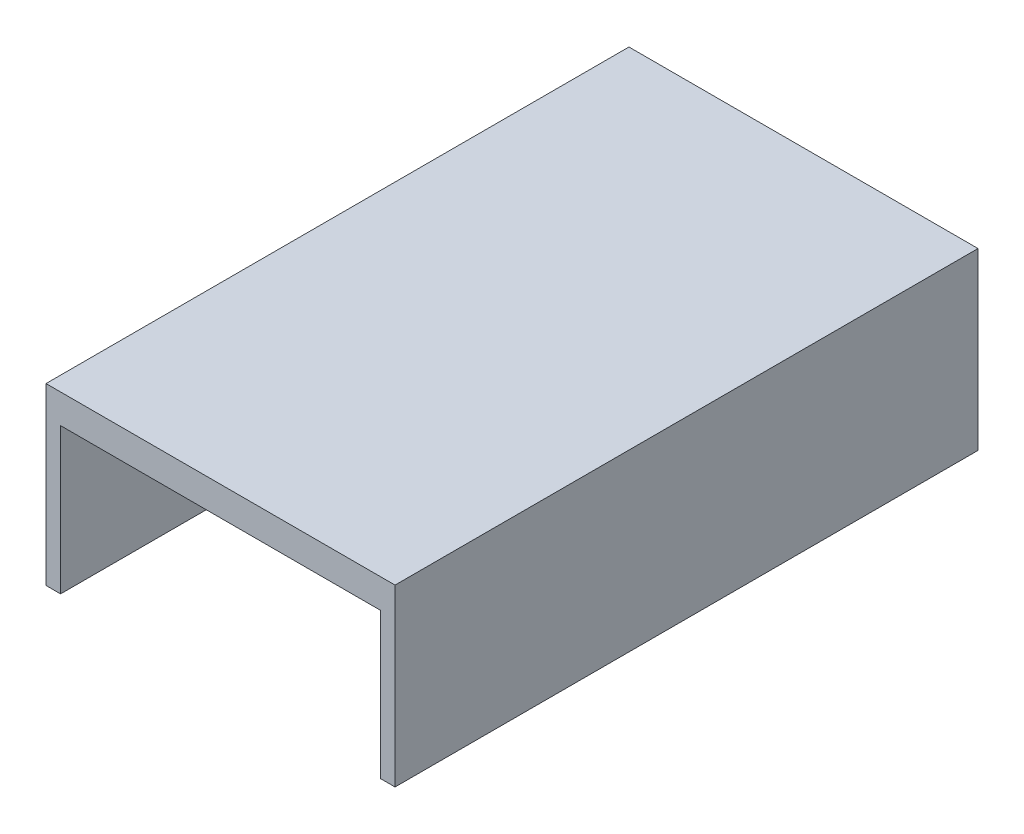
ISO-10303-21;
HEADER;
FILE_DESCRIPTION(('STEP AP214'),'2;1');
FILE_NAME('part.step','',(''),(''),'','','');
FILE_SCHEMA(('AUTOMOTIVE_DESIGN { 1 0 10303 214 1 1 1 1 }'));
ENDSEC;
DATA;
#1=APPLICATION_CONTEXT('core data for automotive mechanical design processes');
#2=APPLICATION_PROTOCOL_DEFINITION('international standard','automotive_design',2000,#1);
#3=PRODUCT_CONTEXT('',#1,'mechanical');
#4=PRODUCT('Part','Part','',(#3));
#5=PRODUCT_RELATED_PRODUCT_CATEGORY('part','',(#4));
#6=PRODUCT_DEFINITION_FORMATION('','',#4);
#7=PRODUCT_DEFINITION_CONTEXT('part definition',#1,'design');
#8=PRODUCT_DEFINITION('design','',#6,#7);
#9=PRODUCT_DEFINITION_SHAPE('','',#8);
#10=(LENGTH_UNIT() NAMED_UNIT(*) SI_UNIT(.MILLI.,.METRE.));
#11=(NAMED_UNIT(*) PLANE_ANGLE_UNIT() SI_UNIT($,.RADIAN.));
#12=(NAMED_UNIT(*) SI_UNIT($,.STERADIAN.) SOLID_ANGLE_UNIT());
#13=UNCERTAINTY_MEASURE_WITH_UNIT(LENGTH_MEASURE(1.E-05),#10,'distance_accuracy_value','');
#14=(GEOMETRIC_REPRESENTATION_CONTEXT(3) GLOBAL_UNCERTAINTY_ASSIGNED_CONTEXT((#13)) GLOBAL_UNIT_ASSIGNED_CONTEXT((#10,
#11,#12)) REPRESENTATION_CONTEXT('',''));
#15=CARTESIAN_POINT('',(0.,0.,0.));
#16=DIRECTION('',(0.,0.,1.));
#17=DIRECTION('',(1.,0.,0.));
#18=AXIS2_PLACEMENT_3D('',#15,#16,#17);
#19=CARTESIAN_POINT('',(59.8770404291593,-60.,-200.));
#20=DIRECTION('',(1.,0.,0.));
#21=DIRECTION('',(0.,0.,-1.));
#22=AXIS2_PLACEMENT_3D('',#19,#20,#21);
#23=PLANE('',#22);
#24=DIRECTION('',(0.,1.,0.));
#25=VECTOR('',#24,1.);
#26=CARTESIAN_POINT('',(59.8770404291593,-60.,0.));
#27=LINE('',#26,#25);
#28=CARTESIAN_POINT('',(59.8770404291593,-60.,0.));
#29=VERTEX_POINT('',#28);
#30=CARTESIAN_POINT('',(59.8770404291593,0.,0.));
#31=VERTEX_POINT('',#30);
#32=EDGE_CURVE('E150',#29,#31,#27,.T.);
#33=ORIENTED_EDGE('',*,*,#32,.F.);
#34=DIRECTION('',(0.,0.,1.));
#35=VECTOR('',#34,1.);
#36=CARTESIAN_POINT('',(59.8770404291593,-60.,-200.));
#37=LINE('',#36,#35);
#38=CARTESIAN_POINT('',(59.8770404291593,-60.,-200.));
#39=VERTEX_POINT('',#38);
#40=EDGE_CURVE('E49',#39,#29,#37,.T.);
#41=ORIENTED_EDGE('',*,*,#40,.F.);
#42=DIRECTION('',(0.,1.,0.));
#43=VECTOR('',#42,1.);
#44=CARTESIAN_POINT('',(59.8770404291593,-60.,-200.));
#45=LINE('',#44,#43);
#46=CARTESIAN_POINT('',(59.8770404291593,0.,-200.));
#47=VERTEX_POINT('',#46);
#48=EDGE_CURVE('E124',#39,#47,#45,.T.);
#49=ORIENTED_EDGE('',*,*,#48,.T.);
#50=DIRECTION('',(0.,0.,1.));
#51=VECTOR('',#50,1.);
#52=CARTESIAN_POINT('',(59.8770404291593,0.,-200.));
#53=LINE('',#52,#51);
#54=EDGE_CURVE('E11',#47,#31,#53,.T.);
#55=ORIENTED_EDGE('',*,*,#54,.T.);
#56=EDGE_LOOP('',(#33,#41,#49,#55));
#57=FACE_BOUND('',#56,.T.);
#58=ADVANCED_FACE('F39',(#57),#23,.T.);
#59=CARTESIAN_POINT('',(54.8770404291594,-60.,-200.));
#60=DIRECTION('',(0.,-1.,0.));
#61=DIRECTION('',(0.,0.,-1.));
#62=AXIS2_PLACEMENT_3D('',#59,#60,#61);
#63=PLANE('',#62);
#64=DIRECTION('',(1.,0.,0.));
#65=VECTOR('',#64,1.);
#66=CARTESIAN_POINT('',(54.8770404291594,-60.,0.));
#67=LINE('',#66,#65);
#68=CARTESIAN_POINT('',(54.8770404291594,-60.,0.));
#69=VERTEX_POINT('',#68);
#70=EDGE_CURVE('E110',#69,#29,#67,.T.);
#71=ORIENTED_EDGE('',*,*,#70,.F.);
#72=DIRECTION('',(0.,0.,1.));
#73=VECTOR('',#72,1.);
#74=CARTESIAN_POINT('',(54.8770404291594,-60.,-200.));
#75=LINE('',#74,#73);
#76=CARTESIAN_POINT('',(54.8770404291594,-60.,-200.));
#77=VERTEX_POINT('',#76);
#78=EDGE_CURVE('E105',#77,#69,#75,.T.);
#79=ORIENTED_EDGE('',*,*,#78,.F.);
#80=DIRECTION('',(1.,0.,0.));
#81=VECTOR('',#80,1.);
#82=CARTESIAN_POINT('',(54.8770404291594,-60.,-200.));
#83=LINE('',#82,#81);
#84=EDGE_CURVE('E108',#77,#39,#83,.T.);
#85=ORIENTED_EDGE('',*,*,#84,.T.);
#86=ORIENTED_EDGE('',*,*,#40,.T.);
#87=EDGE_LOOP('',(#71,#79,#85,#86));
#88=FACE_BOUND('',#87,.T.);
#89=ADVANCED_FACE('F107',(#88),#63,.T.);
#90=CARTESIAN_POINT('',(54.8770404291593,-10.,-200.));
#91=DIRECTION('',(-1.,0.,0.));
#92=DIRECTION('',(0.,-1.,0.));
#93=AXIS2_PLACEMENT_3D('',#90,#91,#92);
#94=PLANE('',#93);
#95=DIRECTION('',(0.,-1.,0.));
#96=VECTOR('',#95,1.);
#97=CARTESIAN_POINT('',(54.8770404291593,-10.,0.));
#98=LINE('',#97,#96);
#99=CARTESIAN_POINT('',(54.8770404291593,-10.,0.));
#100=VERTEX_POINT('',#99);
#101=EDGE_CURVE('E147',#100,#69,#98,.T.);
#102=ORIENTED_EDGE('',*,*,#101,.F.);
#103=DIRECTION('',(0.,0.,1.));
#104=VECTOR('',#103,1.);
#105=CARTESIAN_POINT('',(54.8770404291593,-10.,-200.));
#106=LINE('',#105,#104);
#107=CARTESIAN_POINT('',(54.8770404291593,-10.,-200.));
#108=VERTEX_POINT('',#107);
#109=EDGE_CURVE('E115',#108,#100,#106,.T.);
#110=ORIENTED_EDGE('',*,*,#109,.F.);
#111=DIRECTION('',(0.,-1.,0.));
#112=VECTOR('',#111,1.);
#113=CARTESIAN_POINT('',(54.8770404291593,-10.,-200.));
#114=LINE('',#113,#112);
#115=EDGE_CURVE('E121',#108,#77,#114,.T.);
#116=ORIENTED_EDGE('',*,*,#115,.T.);
#117=ORIENTED_EDGE('',*,*,#78,.T.);
#118=EDGE_LOOP('',(#102,#110,#116,#117));
#119=FACE_BOUND('',#118,.T.);
#120=ADVANCED_FACE('F126',(#119),#94,.T.);
#121=CARTESIAN_POINT('',(-54.8770404291593,-10.,-200.));
#122=DIRECTION('',(0.,-1.,0.));
#123=DIRECTION('',(1.,0.,0.));
#124=AXIS2_PLACEMENT_3D('',#121,#122,#123);
#125=PLANE('',#124);
#126=DIRECTION('',(1.,0.,0.));
#127=VECTOR('',#126,1.);
#128=CARTESIAN_POINT('',(-54.8770404291593,-10.,0.));
#129=LINE('',#128,#127);
#130=CARTESIAN_POINT('',(-54.8770404291593,-10.,0.));
#131=VERTEX_POINT('',#130);
#132=EDGE_CURVE('E144',#131,#100,#129,.T.);
#133=ORIENTED_EDGE('',*,*,#132,.F.);
#134=DIRECTION('',(0.,0.,1.));
#135=VECTOR('',#134,1.);
#136=CARTESIAN_POINT('',(-54.8770404291593,-10.,-200.));
#137=LINE('',#136,#135);
#138=CARTESIAN_POINT('',(-54.8770404291593,-10.,-200.));
#139=VERTEX_POINT('',#138);
#140=EDGE_CURVE('E155',#139,#131,#137,.T.);
#141=ORIENTED_EDGE('',*,*,#140,.F.);
#142=DIRECTION('',(1.,0.,0.));
#143=VECTOR('',#142,1.);
#144=CARTESIAN_POINT('',(-54.8770404291593,-10.,-200.));
#145=LINE('',#144,#143);
#146=EDGE_CURVE('E127',#139,#108,#145,.T.);
#147=ORIENTED_EDGE('',*,*,#146,.T.);
#148=ORIENTED_EDGE('',*,*,#109,.T.);
#149=EDGE_LOOP('',(#133,#141,#147,#148));
#150=FACE_BOUND('',#149,.T.);
#151=ADVANCED_FACE('F180',(#150),#125,.T.);
#152=CARTESIAN_POINT('',(-54.8770404291593,-60.,-200.));
#153=DIRECTION('',(1.,0.,0.));
#154=DIRECTION('',(0.,0.,-1.));
#155=AXIS2_PLACEMENT_3D('',#152,#153,#154);
#156=PLANE('',#155);
#157=DIRECTION('',(0.,1.,0.));
#158=VECTOR('',#157,1.);
#159=CARTESIAN_POINT('',(-54.8770404291593,-60.,0.));
#160=LINE('',#159,#158);
#161=CARTESIAN_POINT('',(-54.8770404291593,-60.,0.));
#162=VERTEX_POINT('',#161);
#163=EDGE_CURVE('E141',#162,#131,#160,.T.);
#164=ORIENTED_EDGE('',*,*,#163,.F.);
#165=DIRECTION('',(0.,0.,1.));
#166=VECTOR('',#165,1.);
#167=CARTESIAN_POINT('',(-54.8770404291593,-60.,-200.));
#168=LINE('',#167,#166);
#169=CARTESIAN_POINT('',(-54.8770404291593,-60.,-200.));
#170=VERTEX_POINT('',#169);
#171=EDGE_CURVE('E157',#170,#162,#168,.T.);
#172=ORIENTED_EDGE('',*,*,#171,.F.);
#173=DIRECTION('',(0.,1.,0.));
#174=VECTOR('',#173,1.);
#175=CARTESIAN_POINT('',(-54.8770404291593,-60.,-200.));
#176=LINE('',#175,#174);
#177=EDGE_CURVE('E129',#170,#139,#176,.T.);
#178=ORIENTED_EDGE('',*,*,#177,.T.);
#179=ORIENTED_EDGE('',*,*,#140,.T.);
#180=EDGE_LOOP('',(#164,#172,#178,#179));
#181=FACE_BOUND('',#180,.T.);
#182=ADVANCED_FACE('F183',(#181),#156,.T.);
#183=CARTESIAN_POINT('',(-59.8770404291593,-60.,-200.));
#184=DIRECTION('',(0.,-1.,0.));
#185=DIRECTION('',(0.,0.,-1.));
#186=AXIS2_PLACEMENT_3D('',#183,#184,#185);
#187=PLANE('',#186);
#188=DIRECTION('',(1.,0.,0.));
#189=VECTOR('',#188,1.);
#190=CARTESIAN_POINT('',(-59.8770404291593,-60.,0.));
#191=LINE('',#190,#189);
#192=CARTESIAN_POINT('',(-59.8770404291593,-60.,0.));
#193=VERTEX_POINT('',#192);
#194=EDGE_CURVE('E138',#193,#162,#191,.T.);
#195=ORIENTED_EDGE('',*,*,#194,.F.);
#196=DIRECTION('',(0.,0.,1.));
#197=VECTOR('',#196,1.);
#198=CARTESIAN_POINT('',(-59.8770404291593,-60.,-200.));
#199=LINE('',#198,#197);
#200=CARTESIAN_POINT('',(-59.8770404291593,-60.,-200.));
#201=VERTEX_POINT('',#200);
#202=EDGE_CURVE('E158',#201,#193,#199,.T.);
#203=ORIENTED_EDGE('',*,*,#202,.F.);
#204=DIRECTION('',(1.,0.,0.));
#205=VECTOR('',#204,1.);
#206=CARTESIAN_POINT('',(-59.8770404291593,-60.,-200.));
#207=LINE('',#206,#205);
#208=EDGE_CURVE('E262',#201,#170,#207,.T.);
#209=ORIENTED_EDGE('',*,*,#208,.T.);
#210=ORIENTED_EDGE('',*,*,#171,.T.);
#211=EDGE_LOOP('',(#195,#203,#209,#210));
#212=FACE_BOUND('',#211,.T.);
#213=ADVANCED_FACE('F187',(#212),#187,.T.);
#214=CARTESIAN_POINT('',(-59.8770404291593,0.,-200.));
#215=DIRECTION('',(-1.,0.,0.));
#216=DIRECTION('',(0.,-1.,0.));
#217=AXIS2_PLACEMENT_3D('',#214,#215,#216);
#218=PLANE('',#217);
#219=DIRECTION('',(0.,-1.,0.));
#220=VECTOR('',#219,1.);
#221=CARTESIAN_POINT('',(-59.8770404291593,0.,0.));
#222=LINE('',#221,#220);
#223=CARTESIAN_POINT('',(-59.8770404291593,0.,0.));
#224=VERTEX_POINT('',#223);
#225=EDGE_CURVE('E135',#224,#193,#222,.T.);
#226=ORIENTED_EDGE('',*,*,#225,.F.);
#227=DIRECTION('',(0.,0.,1.));
#228=VECTOR('',#227,1.);
#229=CARTESIAN_POINT('',(-59.8770404291593,0.,-200.));
#230=LINE('',#229,#228);
#231=CARTESIAN_POINT('',(-59.8770404291593,0.,-200.));
#232=VERTEX_POINT('',#231);
#233=EDGE_CURVE('E43',#232,#224,#230,.T.);
#234=ORIENTED_EDGE('',*,*,#233,.F.);
#235=DIRECTION('',(0.,-1.,0.));
#236=VECTOR('',#235,1.);
#237=CARTESIAN_POINT('',(-59.8770404291593,0.,-200.));
#238=LINE('',#237,#236);
#239=EDGE_CURVE('E263',#232,#201,#238,.T.);
#240=ORIENTED_EDGE('',*,*,#239,.T.);
#241=ORIENTED_EDGE('',*,*,#202,.T.);
#242=EDGE_LOOP('',(#226,#234,#240,#241));
#243=FACE_BOUND('',#242,.T.);
#244=ADVANCED_FACE('F164',(#243),#218,.T.);
#245=CARTESIAN_POINT('',(0.,0.,-200.));
#246=DIRECTION('',(0.,1.,0.));
#247=DIRECTION('',(-1.,0.,0.));
#248=AXIS2_PLACEMENT_3D('',#245,#246,#247);
#249=PLANE('',#248);
#250=DIRECTION('',(-1.,0.,0.));
#251=VECTOR('',#250,1.);
#252=CARTESIAN_POINT('',(0.,0.,0.));
#253=LINE('',#252,#251);
#254=EDGE_CURVE('E88',#31,#224,#253,.T.);
#255=ORIENTED_EDGE('',*,*,#254,.F.);
#256=ORIENTED_EDGE('',*,*,#54,.F.);
#257=DIRECTION('',(-1.,0.,0.));
#258=VECTOR('',#257,1.);
#259=CARTESIAN_POINT('',(59.8770404291593,0.,-200.));
#260=LINE('',#259,#258);
#261=EDGE_CURVE('E91',#47,#232,#260,.T.);
#262=ORIENTED_EDGE('',*,*,#261,.T.);
#263=ORIENTED_EDGE('',*,*,#233,.T.);
#264=EDGE_LOOP('',(#255,#256,#262,#263));
#265=FACE_BOUND('',#264,.T.);
#266=ADVANCED_FACE('F41',(#265),#249,.T.);
#267=CARTESIAN_POINT('',(0.,0.,-200.));
#268=DIRECTION('',(0.,0.,1.));
#269=DIRECTION('',(1.,0.,0.));
#270=AXIS2_PLACEMENT_3D('',#267,#268,#269);
#271=PLANE('',#270);
#272=ORIENTED_EDGE('',*,*,#261,.F.);
#273=ORIENTED_EDGE('',*,*,#48,.F.);
#274=ORIENTED_EDGE('',*,*,#84,.F.);
#275=ORIENTED_EDGE('',*,*,#115,.F.);
#276=ORIENTED_EDGE('',*,*,#146,.F.);
#277=ORIENTED_EDGE('',*,*,#177,.F.);
#278=ORIENTED_EDGE('',*,*,#208,.F.);
#279=ORIENTED_EDGE('',*,*,#239,.F.);
#280=EDGE_LOOP('',(#272,#273,#274,#275,#276,#277,#278,#279));
#281=FACE_BOUND('',#280,.T.);
#282=ADVANCED_FACE('F119',(#281),#271,.F.);
#283=CARTESIAN_POINT('',(0.,0.,0.));
#284=DIRECTION('',(0.,0.,1.));
#285=DIRECTION('',(1.,0.,0.));
#286=AXIS2_PLACEMENT_3D('',#283,#284,#285);
#287=PLANE('',#286);
#288=ORIENTED_EDGE('',*,*,#32,.T.);
#289=ORIENTED_EDGE('',*,*,#254,.T.);
#290=ORIENTED_EDGE('',*,*,#225,.T.);
#291=ORIENTED_EDGE('',*,*,#194,.T.);
#292=ORIENTED_EDGE('',*,*,#163,.T.);
#293=ORIENTED_EDGE('',*,*,#132,.T.);
#294=ORIENTED_EDGE('',*,*,#101,.T.);
#295=ORIENTED_EDGE('',*,*,#70,.T.);
#296=EDGE_LOOP('',(#288,#289,#290,#291,#292,#293,#294,#295));
#297=FACE_BOUND('',#296,.T.);
#298=ADVANCED_FACE('F166',(#297),#287,.T.);
#299=CLOSED_SHELL('',(#58,#89,#120,#151,#182,#213,#244,#266,#282,#298));
#300=MANIFOLD_SOLID_BREP('B2',#299);
#301=ADVANCED_BREP_SHAPE_REPRESENTATION('',(#18,#300),#14);
#302=SHAPE_DEFINITION_REPRESENTATION(#9,#301);
ENDSEC;
END-ISO-10303-21;
